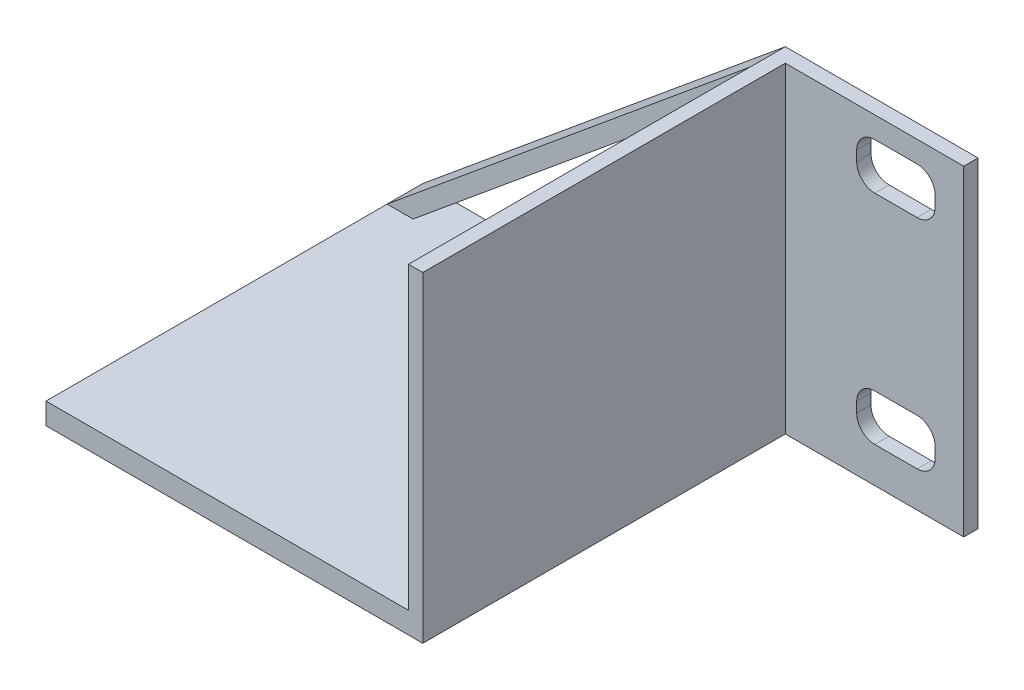
ISO-10303-21;
HEADER;
FILE_DESCRIPTION(('STEP AP214'),'2;1');
FILE_NAME('part.step','',(''),(''),'','','');
FILE_SCHEMA(('AUTOMOTIVE_DESIGN { 1 0 10303 214 1 1 1 1 }'));
ENDSEC;
DATA;
#1=APPLICATION_CONTEXT('core data for automotive mechanical design processes');
#2=APPLICATION_PROTOCOL_DEFINITION('international standard','automotive_design',2000,#1);
#3=PRODUCT_CONTEXT('',#1,'mechanical');
#4=PRODUCT('Part','Part','',(#3));
#5=PRODUCT_RELATED_PRODUCT_CATEGORY('part','',(#4));
#6=PRODUCT_DEFINITION_FORMATION('','',#4);
#7=PRODUCT_DEFINITION_CONTEXT('part definition',#1,'design');
#8=PRODUCT_DEFINITION('design','',#6,#7);
#9=PRODUCT_DEFINITION_SHAPE('','',#8);
#10=(LENGTH_UNIT() NAMED_UNIT(*) SI_UNIT(.MILLI.,.METRE.));
#11=(NAMED_UNIT(*) PLANE_ANGLE_UNIT() SI_UNIT($,.RADIAN.));
#12=(NAMED_UNIT(*) SI_UNIT($,.STERADIAN.) SOLID_ANGLE_UNIT());
#13=UNCERTAINTY_MEASURE_WITH_UNIT(LENGTH_MEASURE(1.E-05),#10,'distance_accuracy_value','');
#14=(GEOMETRIC_REPRESENTATION_CONTEXT(3) GLOBAL_UNCERTAINTY_ASSIGNED_CONTEXT((#13)) GLOBAL_UNIT_ASSIGNED_CONTEXT((#10,
#11,#12)) REPRESENTATION_CONTEXT('',''));
#15=CARTESIAN_POINT('',(0.,0.,0.));
#16=DIRECTION('',(0.,0.,1.));
#17=DIRECTION('',(1.,0.,0.));
#18=AXIS2_PLACEMENT_3D('',#15,#16,#17);
#19=CARTESIAN_POINT('',(0.,0.,2.));
#20=DIRECTION('',(-1.,0.,0.));
#21=DIRECTION('',(0.,-1.,0.));
#22=AXIS2_PLACEMENT_3D('',#19,#20,#21);
#23=PLANE('',#22);
#24=DIRECTION('',(0.,1.,0.));
#25=VECTOR('',#24,1.);
#26=CARTESIAN_POINT('',(0.,0.,0.));
#27=LINE('',#26,#25);
#28=CARTESIAN_POINT('',(0.,0.,0.));
#29=VERTEX_POINT('',#28);
#30=CARTESIAN_POINT('',(0.,45.0000000000001,0.));
#31=VERTEX_POINT('',#30);
#32=EDGE_CURVE('E294',#29,#31,#27,.T.);
#33=ORIENTED_EDGE('',*,*,#32,.T.);
#34=DIRECTION('',(0.,0.,-1.));
#35=VECTOR('',#34,1.);
#36=CARTESIAN_POINT('',(0.,45.0000000000001,2.));
#37=LINE('',#36,#35);
#38=CARTESIAN_POINT('',(0.,45.0000000000001,2.));
#39=VERTEX_POINT('',#38);
#40=EDGE_CURVE('E325',#39,#31,#37,.T.);
#41=ORIENTED_EDGE('',*,*,#40,.F.);
#42=DIRECTION('',(0.,1.,0.));
#43=VECTOR('',#42,1.);
#44=CARTESIAN_POINT('',(0.,0.,2.));
#45=LINE('',#44,#43);
#46=CARTESIAN_POINT('',(0.,0.,2.));
#47=VERTEX_POINT('',#46);
#48=EDGE_CURVE('E305',#47,#39,#45,.T.);
#49=ORIENTED_EDGE('',*,*,#48,.F.);
#50=DIRECTION('',(0.,0.,-1.));
#51=VECTOR('',#50,1.);
#52=CARTESIAN_POINT('',(0.,0.,2.));
#53=LINE('',#52,#51);
#54=EDGE_CURVE('E317',#47,#29,#53,.T.);
#55=ORIENTED_EDGE('',*,*,#54,.T.);
#56=EDGE_LOOP('',(#33,#41,#49,#55));
#57=FACE_BOUND('',#56,.T.);
#58=ADVANCED_FACE('F33',(#57),#23,.F.);
#59=CARTESIAN_POINT('',(0.,45.0000000000001,2.));
#60=DIRECTION('',(0.,-1.,0.));
#61=DIRECTION('',(1.,0.,0.));
#62=AXIS2_PLACEMENT_3D('',#59,#60,#61);
#63=PLANE('',#62);
#64=DIRECTION('',(-1.,0.,0.));
#65=VECTOR('',#64,1.);
#66=CARTESIAN_POINT('',(0.,45.0000000000001,0.));
#67=LINE('',#66,#65);
#68=CARTESIAN_POINT('',(-27.,45.,0.));
#69=VERTEX_POINT('',#68);
#70=EDGE_CURVE('E320',#31,#69,#67,.T.);
#71=ORIENTED_EDGE('',*,*,#70,.T.);
#72=DIRECTION('',(0.,0.,-1.));
#73=VECTOR('',#72,1.);
#74=CARTESIAN_POINT('',(-27.,45.,5.));
#75=LINE('',#74,#73);
#76=CARTESIAN_POINT('',(-27.,45.,5.));
#77=VERTEX_POINT('',#76);
#78=EDGE_CURVE('E56',#77,#69,#75,.T.);
#79=ORIENTED_EDGE('',*,*,#78,.F.);
#80=DIRECTION('',(0.,0.,-1.));
#81=VECTOR('',#80,1.);
#82=CARTESIAN_POINT('',(-27.,45.,2.));
#83=LINE('',#82,#81);
#84=CARTESIAN_POINT('',(-27.,45.,52.8));
#85=VERTEX_POINT('',#84);
#86=EDGE_CURVE('E266',#85,#77,#83,.T.);
#87=ORIENTED_EDGE('',*,*,#86,.F.);
#88=DIRECTION('',(1.,0.,0.));
#89=VECTOR('',#88,1.);
#90=CARTESIAN_POINT('',(-27.,45.,52.8));
#91=LINE('',#90,#89);
#92=CARTESIAN_POINT('',(-25.,45.,52.8));
#93=VERTEX_POINT('',#92);
#94=EDGE_CURVE('E268',#85,#93,#91,.T.);
#95=ORIENTED_EDGE('',*,*,#94,.T.);
#96=DIRECTION('',(0.,0.,-1.));
#97=VECTOR('',#96,1.);
#98=CARTESIAN_POINT('',(-25.,45.,0.));
#99=LINE('',#98,#97);
#100=CARTESIAN_POINT('',(-25.,45.,2.));
#101=VERTEX_POINT('',#100);
#102=EDGE_CURVE('E264',#93,#101,#99,.T.);
#103=ORIENTED_EDGE('',*,*,#102,.T.);
#104=DIRECTION('',(-1.,0.,0.));
#105=VECTOR('',#104,1.);
#106=CARTESIAN_POINT('',(0.,45.0000000000001,2.));
#107=LINE('',#106,#105);
#108=EDGE_CURVE('E308',#39,#101,#107,.T.);
#109=ORIENTED_EDGE('',*,*,#108,.F.);
#110=ORIENTED_EDGE('',*,*,#40,.T.);
#111=EDGE_LOOP('',(#71,#79,#87,#95,#103,#109,#110));
#112=FACE_BOUND('',#111,.T.);
#113=ADVANCED_FACE('F468',(#112),#63,.F.);
#114=CARTESIAN_POINT('',(0.,0.,2.));
#115=DIRECTION('',(0.,1.,0.));
#116=DIRECTION('',(-1.,0.,0.));
#117=AXIS2_PLACEMENT_3D('',#114,#115,#116);
#118=PLANE('',#117);
#119=CARTESIAN_POINT('',(-39.7,-1.23599047663348E-13,17.7));
#120=DIRECTION('',(0.,1.,0.));
#121=DIRECTION('',(-1.,0.,0.));
#122=AXIS2_PLACEMENT_3D('',#119,#120,#121);
#123=CIRCLE('',#122,6.35);
#124=CARTESIAN_POINT('',(-46.05,-1.43351375886795E-13,17.7));
#125=VERTEX_POINT('',#124);
#126=EDGE_CURVE('E784',#125,#125,#123,.T.);
#127=ORIENTED_EDGE('',*,*,#126,.T.);
#128=EDGE_LOOP('',(#127));
#129=FACE_BOUND('',#128,.T.);
#130=DIRECTION('',(1.,0.,0.));
#131=VECTOR('',#130,1.);
#132=CARTESIAN_POINT('',(0.,0.,0.));
#133=LINE('',#132,#131);
#134=CARTESIAN_POINT('',(-77.8,0.,0.));
#135=VERTEX_POINT('',#134);
#136=EDGE_CURVE('E309',#135,#29,#133,.T.);
#137=ORIENTED_EDGE('',*,*,#136,.T.);
#138=ORIENTED_EDGE('',*,*,#54,.F.);
#139=DIRECTION('',(1.,0.,0.));
#140=VECTOR('',#139,1.);
#141=CARTESIAN_POINT('',(0.,0.,2.));
#142=LINE('',#141,#140);
#143=CARTESIAN_POINT('',(-25.,0.,2.));
#144=VERTEX_POINT('',#143);
#145=EDGE_CURVE('E315',#144,#47,#142,.T.);
#146=ORIENTED_EDGE('',*,*,#145,.F.);
#147=DIRECTION('',(0.,0.,1.));
#148=VECTOR('',#147,1.);
#149=CARTESIAN_POINT('',(-25.,0.,2.));
#150=LINE('',#149,#148);
#151=CARTESIAN_POINT('',(-25.,0.,52.8));
#152=VERTEX_POINT('',#151);
#153=EDGE_CURVE('E260',#144,#152,#150,.T.);
#154=ORIENTED_EDGE('',*,*,#153,.T.);
#155=DIRECTION('',(1.,0.,0.));
#156=VECTOR('',#155,1.);
#157=CARTESIAN_POINT('',(-27.,0.,52.8));
#158=LINE('',#157,#156);
#159=CARTESIAN_POINT('',(-77.8,0.,52.8));
#160=VERTEX_POINT('',#159);
#161=EDGE_CURVE('E277',#160,#152,#158,.T.);
#162=ORIENTED_EDGE('',*,*,#161,.F.);
#163=DIRECTION('',(0.,0.,1.));
#164=VECTOR('',#163,1.);
#165=CARTESIAN_POINT('',(-77.8,0.,0.));
#166=LINE('',#165,#164);
#167=EDGE_CURVE('E251',#135,#160,#166,.T.);
#168=ORIENTED_EDGE('',*,*,#167,.F.);
#169=EDGE_LOOP('',(#137,#138,#146,#154,#162,#168));
#170=FACE_BOUND('',#169,.T.);
#171=ADVANCED_FACE('F474',(#129,#170),#118,.F.);
#172=CARTESIAN_POINT('',(0.,0.,2.));
#173=DIRECTION('',(0.,0.,1.));
#174=DIRECTION('',(1.,0.,0.));
#175=AXIS2_PLACEMENT_3D('',#172,#173,#174);
#176=PLANE('',#175);
#177=DIRECTION('',(-1.,0.,0.));
#178=VECTOR('',#177,1.);
#179=CARTESIAN_POINT('',(-4.,11.5,2.));
#180=LINE('',#179,#178);
#181=CARTESIAN_POINT('',(-6.54,11.5,2.));
#182=VERTEX_POINT('',#181);
#183=CARTESIAN_POINT('',(-12.46,11.5,2.));
#184=VERTEX_POINT('',#183);
#185=EDGE_CURVE('E281',#182,#184,#180,.T.);
#186=ORIENTED_EDGE('',*,*,#185,.F.);
#187=CARTESIAN_POINT('',(-6.54,8.96000000000004,2.));
#188=DIRECTION('',(0.,0.,1.));
#189=DIRECTION('',(1.,0.,0.));
#190=AXIS2_PLACEMENT_3D('',#187,#188,#189);
#191=CIRCLE('',#190,2.54);
#192=CARTESIAN_POINT('',(-4.,8.96000000000004,2.));
#193=VERTEX_POINT('',#192);
#194=EDGE_CURVE('E404',#182,#193,#191,.F.);
#195=ORIENTED_EDGE('',*,*,#194,.T.);
#196=DIRECTION('',(0.,1.,0.));
#197=VECTOR('',#196,1.);
#198=CARTESIAN_POINT('',(-4.,5.00000000000004,2.));
#199=LINE('',#198,#197);
#200=CARTESIAN_POINT('',(-4.,7.54000000000004,2.));
#201=VERTEX_POINT('',#200);
#202=EDGE_CURVE('E291',#201,#193,#199,.T.);
#203=ORIENTED_EDGE('',*,*,#202,.F.);
#204=CARTESIAN_POINT('',(-6.54,7.54000000000004,2.));
#205=DIRECTION('',(0.,0.,1.));
#206=DIRECTION('',(1.,0.,0.));
#207=AXIS2_PLACEMENT_3D('',#204,#205,#206);
#208=CIRCLE('',#207,2.54);
#209=CARTESIAN_POINT('',(-6.54000000000001,5.00000000000004,2.));
#210=VERTEX_POINT('',#209);
#211=EDGE_CURVE('E400',#201,#210,#208,.F.);
#212=ORIENTED_EDGE('',*,*,#211,.T.);
#213=DIRECTION('',(1.,0.,0.));
#214=VECTOR('',#213,1.);
#215=CARTESIAN_POINT('',(-15.,5.00000000000004,2.));
#216=LINE('',#215,#214);
#217=CARTESIAN_POINT('',(-12.46,5.00000000000004,2.));
#218=VERTEX_POINT('',#217);
#219=EDGE_CURVE('E288',#218,#210,#216,.T.);
#220=ORIENTED_EDGE('',*,*,#219,.F.);
#221=CARTESIAN_POINT('',(-12.46,7.54000000000004,2.));
#222=DIRECTION('',(0.,0.,1.));
#223=DIRECTION('',(1.,0.,0.));
#224=AXIS2_PLACEMENT_3D('',#221,#222,#223);
#225=CIRCLE('',#224,2.54);
#226=CARTESIAN_POINT('',(-15.,7.54000000000004,2.));
#227=VERTEX_POINT('',#226);
#228=EDGE_CURVE('E392',#218,#227,#225,.F.);
#229=ORIENTED_EDGE('',*,*,#228,.T.);
#230=DIRECTION('',(0.,-1.,0.));
#231=VECTOR('',#230,1.);
#232=CARTESIAN_POINT('',(-15.,11.5,2.));
#233=LINE('',#232,#231);
#234=CARTESIAN_POINT('',(-15.,8.96000000000004,2.));
#235=VERTEX_POINT('',#234);
#236=EDGE_CURVE('E284',#235,#227,#233,.T.);
#237=ORIENTED_EDGE('',*,*,#236,.F.);
#238=CARTESIAN_POINT('',(-12.46,8.96000000000004,2.));
#239=DIRECTION('',(0.,0.,1.));
#240=DIRECTION('',(1.,0.,0.));
#241=AXIS2_PLACEMENT_3D('',#238,#239,#240);
#242=CIRCLE('',#241,2.54);
#243=EDGE_CURVE('E396',#235,#184,#242,.F.);
#244=ORIENTED_EDGE('',*,*,#243,.T.);
#245=EDGE_LOOP('',(#186,#195,#203,#212,#220,#229,#237,#244));
#246=FACE_BOUND('',#245,.T.);
#247=DIRECTION('',(-1.,0.,0.));
#248=VECTOR('',#247,1.);
#249=CARTESIAN_POINT('',(-4.00000000000002,42.0000000000001,2.));
#250=LINE('',#249,#248);
#251=CARTESIAN_POINT('',(-6.54000000000004,42.0000000000001,2.));
#252=VERTEX_POINT('',#251);
#253=CARTESIAN_POINT('',(-12.46,42.,2.));
#254=VERTEX_POINT('',#253);
#255=EDGE_CURVE('E280',#252,#254,#250,.T.);
#256=ORIENTED_EDGE('',*,*,#255,.F.);
#257=CARTESIAN_POINT('',(-6.54000000000002,39.4600000000001,2.));
#258=DIRECTION('',(0.,0.,1.));
#259=DIRECTION('',(1.,0.,0.));
#260=AXIS2_PLACEMENT_3D('',#257,#258,#259);
#261=CIRCLE('',#260,2.54);
#262=CARTESIAN_POINT('',(-4.00000000000002,39.4600000000001,2.));
#263=VERTEX_POINT('',#262);
#264=EDGE_CURVE('E412',#252,#263,#261,.F.);
#265=ORIENTED_EDGE('',*,*,#264,.T.);
#266=DIRECTION('',(0.,1.,0.));
#267=VECTOR('',#266,1.);
#268=CARTESIAN_POINT('',(-4.00000000000002,35.5,2.));
#269=LINE('',#268,#267);
#270=CARTESIAN_POINT('',(-4.00000000000002,38.04,2.));
#271=VERTEX_POINT('',#270);
#272=EDGE_CURVE('E285',#271,#263,#269,.T.);
#273=ORIENTED_EDGE('',*,*,#272,.F.);
#274=CARTESIAN_POINT('',(-6.54000000000002,38.04,2.));
#275=DIRECTION('',(0.,0.,1.));
#276=DIRECTION('',(1.,0.,0.));
#277=AXIS2_PLACEMENT_3D('',#274,#275,#276);
#278=CIRCLE('',#277,2.54);
#279=CARTESIAN_POINT('',(-6.54000000000002,35.5,2.));
#280=VERTEX_POINT('',#279);
#281=EDGE_CURVE('E408',#271,#280,#278,.F.);
#282=ORIENTED_EDGE('',*,*,#281,.T.);
#283=DIRECTION('',(1.,0.,0.));
#284=VECTOR('',#283,1.);
#285=CARTESIAN_POINT('',(-15.,35.5,2.));
#286=LINE('',#285,#284);
#287=CARTESIAN_POINT('',(-12.46,35.5,2.));
#288=VERTEX_POINT('',#287);
#289=EDGE_CURVE('E300',#288,#280,#286,.T.);
#290=ORIENTED_EDGE('',*,*,#289,.F.);
#291=CARTESIAN_POINT('',(-12.46,38.04,2.));
#292=DIRECTION('',(0.,0.,1.));
#293=DIRECTION('',(1.,0.,0.));
#294=AXIS2_PLACEMENT_3D('',#291,#292,#293);
#295=CIRCLE('',#294,2.54);
#296=CARTESIAN_POINT('',(-15.,38.04,2.));
#297=VERTEX_POINT('',#296);
#298=EDGE_CURVE('E41',#288,#297,#295,.F.);
#299=ORIENTED_EDGE('',*,*,#298,.T.);
#300=DIRECTION('',(0.,-1.,0.));
#301=VECTOR('',#300,1.);
#302=CARTESIAN_POINT('',(-15.,42.,2.));
#303=LINE('',#302,#301);
#304=CARTESIAN_POINT('',(-15.,39.4600000000001,2.));
#305=VERTEX_POINT('',#304);
#306=EDGE_CURVE('E297',#305,#297,#303,.T.);
#307=ORIENTED_EDGE('',*,*,#306,.F.);
#308=CARTESIAN_POINT('',(-12.46,39.4600000000001,2.));
#309=DIRECTION('',(0.,0.,1.));
#310=DIRECTION('',(1.,0.,0.));
#311=AXIS2_PLACEMENT_3D('',#308,#309,#310);
#312=CIRCLE('',#311,2.54);
#313=EDGE_CURVE('E416',#305,#254,#312,.F.);
#314=ORIENTED_EDGE('',*,*,#313,.T.);
#315=EDGE_LOOP('',(#256,#265,#273,#282,#290,#299,#307,#314));
#316=FACE_BOUND('',#315,.T.);
#317=ORIENTED_EDGE('',*,*,#48,.T.);
#318=ORIENTED_EDGE('',*,*,#108,.T.);
#319=DIRECTION('',(0.,-1.,0.));
#320=VECTOR('',#319,1.);
#321=CARTESIAN_POINT('',(-25.,0.,2.));
#322=LINE('',#321,#320);
#323=EDGE_CURVE('E312',#101,#144,#322,.T.);
#324=ORIENTED_EDGE('',*,*,#323,.T.);
#325=ORIENTED_EDGE('',*,*,#145,.T.);
#326=EDGE_LOOP('',(#317,#318,#324,#325));
#327=FACE_BOUND('',#326,.T.);
#328=ADVANCED_FACE('F423',(#246,#316,#327),#176,.T.);
#329=CARTESIAN_POINT('',(0.,0.,0.));
#330=DIRECTION('',(0.,0.,1.));
#331=DIRECTION('',(1.,0.,0.));
#332=AXIS2_PLACEMENT_3D('',#329,#330,#331);
#333=PLANE('',#332);
#334=DIRECTION('',(-0.770702582293763,-0.637195048353113,0.));
#335=VECTOR('',#334,1.);
#336=CARTESIAN_POINT('',(-77.8,0.,0.));
#337=LINE('',#336,#335);
#338=CARTESIAN_POINT('',(-27.,42.,0.));
#339=VERTEX_POINT('',#338);
#340=CARTESIAN_POINT('',(-74.1714285714286,2.99999999999992,0.));
#341=VERTEX_POINT('',#340);
#342=EDGE_CURVE('E785',#339,#341,#337,.T.);
#343=ORIENTED_EDGE('',*,*,#342,.T.);
#344=DIRECTION('',(1.,0.,0.));
#345=VECTOR('',#344,1.);
#346=CARTESIAN_POINT('',(-77.8,2.99999999999992,0.));
#347=LINE('',#346,#345);
#348=CARTESIAN_POINT('',(-27.,2.99999999999992,0.));
#349=VERTEX_POINT('',#348);
#350=EDGE_CURVE('E246',#341,#349,#347,.T.);
#351=ORIENTED_EDGE('',*,*,#350,.T.);
#352=DIRECTION('',(0.,-1.,0.));
#353=VECTOR('',#352,1.);
#354=CARTESIAN_POINT('',(-27.,45.,0.));
#355=LINE('',#354,#353);
#356=EDGE_CURVE('E261',#339,#349,#355,.T.);
#357=ORIENTED_EDGE('',*,*,#356,.F.);
#358=EDGE_LOOP('',(#343,#351,#357));
#359=FACE_BOUND('',#358,.T.);
#360=DIRECTION('',(1.,0.,0.));
#361=VECTOR('',#360,1.);
#362=CARTESIAN_POINT('',(0.,5.00000000000004,0.));
#363=LINE('',#362,#361);
#364=CARTESIAN_POINT('',(-12.46,5.00000000000004,0.));
#365=VERTEX_POINT('',#364);
#366=CARTESIAN_POINT('',(-6.54,5.00000000000004,0.));
#367=VERTEX_POINT('',#366);
#368=EDGE_CURVE('E343',#365,#367,#363,.T.);
#369=ORIENTED_EDGE('',*,*,#368,.T.);
#370=CARTESIAN_POINT('',(-6.54,7.54000000000004,0.));
#371=DIRECTION('',(0.,0.,1.));
#372=DIRECTION('',(1.,0.,0.));
#373=AXIS2_PLACEMENT_3D('',#370,#371,#372);
#374=CIRCLE('',#373,2.54);
#375=CARTESIAN_POINT('',(-4.,7.54000000000004,0.));
#376=VERTEX_POINT('',#375);
#377=EDGE_CURVE('E402',#367,#376,#374,.T.);
#378=ORIENTED_EDGE('',*,*,#377,.T.);
#379=DIRECTION('',(0.,1.,0.));
#380=VECTOR('',#379,1.);
#381=CARTESIAN_POINT('',(-4.,0.,0.));
#382=LINE('',#381,#380);
#383=CARTESIAN_POINT('',(-4.,8.96000000000004,0.));
#384=VERTEX_POINT('',#383);
#385=EDGE_CURVE('E346',#376,#384,#382,.T.);
#386=ORIENTED_EDGE('',*,*,#385,.T.);
#387=CARTESIAN_POINT('',(-6.54,8.96000000000004,0.));
#388=DIRECTION('',(0.,0.,1.));
#389=DIRECTION('',(1.,0.,0.));
#390=AXIS2_PLACEMENT_3D('',#387,#388,#389);
#391=CIRCLE('',#390,2.54);
#392=CARTESIAN_POINT('',(-6.54,11.5,0.));
#393=VERTEX_POINT('',#392);
#394=EDGE_CURVE('E406',#384,#393,#391,.T.);
#395=ORIENTED_EDGE('',*,*,#394,.T.);
#396=DIRECTION('',(-1.,0.,0.));
#397=VECTOR('',#396,1.);
#398=CARTESIAN_POINT('',(0.,11.5,0.));
#399=LINE('',#398,#397);
#400=CARTESIAN_POINT('',(-12.46,11.5,0.));
#401=VERTEX_POINT('',#400);
#402=EDGE_CURVE('E349',#393,#401,#399,.T.);
#403=ORIENTED_EDGE('',*,*,#402,.T.);
#404=CARTESIAN_POINT('',(-12.46,8.96000000000004,0.));
#405=DIRECTION('',(0.,0.,1.));
#406=DIRECTION('',(1.,0.,0.));
#407=AXIS2_PLACEMENT_3D('',#404,#405,#406);
#408=CIRCLE('',#407,2.54);
#409=CARTESIAN_POINT('',(-15.,8.96000000000004,0.));
#410=VERTEX_POINT('',#409);
#411=EDGE_CURVE('E398',#401,#410,#408,.T.);
#412=ORIENTED_EDGE('',*,*,#411,.T.);
#413=DIRECTION('',(0.,-1.,0.));
#414=VECTOR('',#413,1.);
#415=CARTESIAN_POINT('',(-15.,0.,0.));
#416=LINE('',#415,#414);
#417=CARTESIAN_POINT('',(-15.,7.54000000000004,0.));
#418=VERTEX_POINT('',#417);
#419=EDGE_CURVE('E340',#410,#418,#416,.T.);
#420=ORIENTED_EDGE('',*,*,#419,.T.);
#421=CARTESIAN_POINT('',(-12.46,7.54000000000004,0.));
#422=DIRECTION('',(0.,0.,1.));
#423=DIRECTION('',(1.,0.,0.));
#424=AXIS2_PLACEMENT_3D('',#421,#422,#423);
#425=CIRCLE('',#424,2.54);
#426=EDGE_CURVE('E394',#418,#365,#425,.T.);
#427=ORIENTED_EDGE('',*,*,#426,.T.);
#428=EDGE_LOOP('',(#369,#378,#386,#395,#403,#412,#420,#427));
#429=FACE_BOUND('',#428,.T.);
#430=DIRECTION('',(1.,0.,0.));
#431=VECTOR('',#430,1.);
#432=CARTESIAN_POINT('',(0.,35.5,0.));
#433=LINE('',#432,#431);
#434=CARTESIAN_POINT('',(-12.46,35.5,0.));
#435=VERTEX_POINT('',#434);
#436=CARTESIAN_POINT('',(-6.54000000000002,35.5,0.));
#437=VERTEX_POINT('',#436);
#438=EDGE_CURVE('E331',#435,#437,#433,.T.);
#439=ORIENTED_EDGE('',*,*,#438,.T.);
#440=CARTESIAN_POINT('',(-6.54000000000002,38.04,0.));
#441=DIRECTION('',(0.,0.,1.));
#442=DIRECTION('',(1.,0.,0.));
#443=AXIS2_PLACEMENT_3D('',#440,#441,#442);
#444=CIRCLE('',#443,2.54);
#445=CARTESIAN_POINT('',(-4.00000000000002,38.04,0.));
#446=VERTEX_POINT('',#445);
#447=EDGE_CURVE('E410',#437,#446,#444,.T.);
#448=ORIENTED_EDGE('',*,*,#447,.T.);
#449=DIRECTION('',(0.,1.,0.));
#450=VECTOR('',#449,1.);
#451=CARTESIAN_POINT('',(-4.00000000000002,0.,0.));
#452=LINE('',#451,#450);
#453=CARTESIAN_POINT('',(-4.00000000000002,39.4600000000001,0.));
#454=VERTEX_POINT('',#453);
#455=EDGE_CURVE('E334',#446,#454,#452,.T.);
#456=ORIENTED_EDGE('',*,*,#455,.T.);
#457=CARTESIAN_POINT('',(-6.54000000000002,39.4600000000001,0.));
#458=DIRECTION('',(0.,0.,1.));
#459=DIRECTION('',(1.,0.,0.));
#460=AXIS2_PLACEMENT_3D('',#457,#458,#459);
#461=CIRCLE('',#460,2.54);
#462=CARTESIAN_POINT('',(-6.54000000000004,42.0000000000001,0.));
#463=VERTEX_POINT('',#462);
#464=EDGE_CURVE('E414',#454,#463,#461,.T.);
#465=ORIENTED_EDGE('',*,*,#464,.T.);
#466=DIRECTION('',(-1.,0.,0.));
#467=VECTOR('',#466,1.);
#468=CARTESIAN_POINT('',(-2.1195166833753E-13,42.0000000000001,0.));
#469=LINE('',#468,#467);
#470=CARTESIAN_POINT('',(-12.46,42.,0.));
#471=VERTEX_POINT('',#470);
#472=EDGE_CURVE('E337',#463,#471,#469,.T.);
#473=ORIENTED_EDGE('',*,*,#472,.T.);
#474=CARTESIAN_POINT('',(-12.46,39.4600000000001,0.));
#475=DIRECTION('',(0.,0.,1.));
#476=DIRECTION('',(1.,0.,0.));
#477=AXIS2_PLACEMENT_3D('',#474,#475,#476);
#478=CIRCLE('',#477,2.54);
#479=CARTESIAN_POINT('',(-15.,39.4600000000001,0.));
#480=VERTEX_POINT('',#479);
#481=EDGE_CURVE('E418',#471,#480,#478,.T.);
#482=ORIENTED_EDGE('',*,*,#481,.T.);
#483=DIRECTION('',(0.,-1.,0.));
#484=VECTOR('',#483,1.);
#485=CARTESIAN_POINT('',(-15.,0.,0.));
#486=LINE('',#485,#484);
#487=CARTESIAN_POINT('',(-15.,38.04,0.));
#488=VERTEX_POINT('',#487);
#489=EDGE_CURVE('E328',#480,#488,#486,.T.);
#490=ORIENTED_EDGE('',*,*,#489,.T.);
#491=CARTESIAN_POINT('',(-12.46,38.04,0.));
#492=DIRECTION('',(0.,0.,1.));
#493=DIRECTION('',(1.,0.,0.));
#494=AXIS2_PLACEMENT_3D('',#491,#492,#493);
#495=CIRCLE('',#494,2.54);
#496=EDGE_CURVE('E11',#488,#435,#495,.T.);
#497=ORIENTED_EDGE('',*,*,#496,.T.);
#498=EDGE_LOOP('',(#439,#448,#456,#465,#473,#482,#490,#497));
#499=FACE_BOUND('',#498,.T.);
#500=ORIENTED_EDGE('',*,*,#136,.F.);
#501=DIRECTION('',(0.,-1.,0.));
#502=VECTOR('',#501,1.);
#503=CARTESIAN_POINT('',(-77.8,0.,0.));
#504=LINE('',#503,#502);
#505=CARTESIAN_POINT('',(-77.8,2.99999999999992,0.));
#506=VERTEX_POINT('',#505);
#507=EDGE_CURVE('E257',#506,#135,#504,.T.);
#508=ORIENTED_EDGE('',*,*,#507,.F.);
#509=DIRECTION('',(0.770702582293763,0.637195048353113,0.));
#510=VECTOR('',#509,1.);
#511=CARTESIAN_POINT('',(-27.,45.,0.));
#512=LINE('',#511,#510);
#513=EDGE_CURVE('E218',#506,#69,#512,.T.);
#514=ORIENTED_EDGE('',*,*,#513,.T.);
#515=ORIENTED_EDGE('',*,*,#70,.F.);
#516=ORIENTED_EDGE('',*,*,#32,.F.);
#517=EDGE_LOOP('',(#500,#508,#514,#515,#516));
#518=FACE_BOUND('',#517,.T.);
#519=ADVANCED_FACE('F435',(#359,#429,#499,#518),#333,.F.);
#520=CARTESIAN_POINT('',(-4.00000000000002,42.0000000000001,-17.78));
#521=DIRECTION('',(0.,1.,0.));
#522=DIRECTION('',(-1.,0.,0.));
#523=AXIS2_PLACEMENT_3D('',#520,#521,#522);
#524=PLANE('',#523);
#525=ORIENTED_EDGE('',*,*,#472,.F.);
#526=DIRECTION('',(0.,0.,1.));
#527=VECTOR('',#526,1.);
#528=CARTESIAN_POINT('',(-6.54000000000004,42.0000000000001,2.));
#529=LINE('',#528,#527);
#530=EDGE_CURVE('E384',#463,#252,#529,.T.);
#531=ORIENTED_EDGE('',*,*,#530,.T.);
#532=ORIENTED_EDGE('',*,*,#255,.T.);
#533=DIRECTION('',(0.,0.,1.));
#534=VECTOR('',#533,1.);
#535=CARTESIAN_POINT('',(-12.46,42.,0.));
#536=LINE('',#535,#534);
#537=EDGE_CURVE('E382',#254,#471,#536,.F.);
#538=ORIENTED_EDGE('',*,*,#537,.T.);
#539=EDGE_LOOP('',(#525,#531,#532,#538));
#540=FACE_BOUND('',#539,.T.);
#541=ADVANCED_FACE('F456',(#540),#524,.F.);
#542=CARTESIAN_POINT('',(-4.00000000000002,35.5,-17.78));
#543=DIRECTION('',(1.,0.,0.));
#544=DIRECTION('',(0.,0.,-1.));
#545=AXIS2_PLACEMENT_3D('',#542,#543,#544);
#546=PLANE('',#545);
#547=ORIENTED_EDGE('',*,*,#455,.F.);
#548=DIRECTION('',(0.,0.,1.));
#549=VECTOR('',#548,1.);
#550=CARTESIAN_POINT('',(-4.00000000000002,38.04,2.));
#551=LINE('',#550,#549);
#552=EDGE_CURVE('E374',#446,#271,#551,.T.);
#553=ORIENTED_EDGE('',*,*,#552,.T.);
#554=ORIENTED_EDGE('',*,*,#272,.T.);
#555=DIRECTION('',(0.,0.,1.));
#556=VECTOR('',#555,1.);
#557=CARTESIAN_POINT('',(-4.00000000000002,39.4600000000001,0.));
#558=LINE('',#557,#556);
#559=EDGE_CURVE('E372',#263,#454,#558,.F.);
#560=ORIENTED_EDGE('',*,*,#559,.T.);
#561=EDGE_LOOP('',(#547,#553,#554,#560));
#562=FACE_BOUND('',#561,.T.);
#563=ADVANCED_FACE('F447',(#562),#546,.F.);
#564=CARTESIAN_POINT('',(-15.,35.5,-17.78));
#565=DIRECTION('',(0.,-1.,0.));
#566=DIRECTION('',(0.,0.,-1.));
#567=AXIS2_PLACEMENT_3D('',#564,#565,#566);
#568=PLANE('',#567);
#569=ORIENTED_EDGE('',*,*,#289,.T.);
#570=DIRECTION('',(0.,0.,1.));
#571=VECTOR('',#570,1.);
#572=CARTESIAN_POINT('',(-6.54000000000002,35.5,0.));
#573=LINE('',#572,#571);
#574=EDGE_CURVE('E380',#280,#437,#573,.F.);
#575=ORIENTED_EDGE('',*,*,#574,.T.);
#576=ORIENTED_EDGE('',*,*,#438,.F.);
#577=DIRECTION('',(0.,0.,1.));
#578=VECTOR('',#577,1.);
#579=CARTESIAN_POINT('',(-12.46,35.5,2.));
#580=LINE('',#579,#578);
#581=EDGE_CURVE('E377',#435,#288,#580,.T.);
#582=ORIENTED_EDGE('',*,*,#581,.T.);
#583=EDGE_LOOP('',(#569,#575,#576,#582));
#584=FACE_BOUND('',#583,.T.);
#585=ADVANCED_FACE('F439',(#584),#568,.F.);
#586=CARTESIAN_POINT('',(-15.,42.,-17.78));
#587=DIRECTION('',(-1.,0.,0.));
#588=DIRECTION('',(0.,0.,1.));
#589=AXIS2_PLACEMENT_3D('',#586,#587,#588);
#590=PLANE('',#589);
#591=ORIENTED_EDGE('',*,*,#489,.F.);
#592=DIRECTION('',(0.,0.,1.));
#593=VECTOR('',#592,1.);
#594=CARTESIAN_POINT('',(-15.,39.4600000000001,2.));
#595=LINE('',#594,#593);
#596=EDGE_CURVE('E389',#480,#305,#595,.T.);
#597=ORIENTED_EDGE('',*,*,#596,.T.);
#598=ORIENTED_EDGE('',*,*,#306,.T.);
#599=DIRECTION('',(0.,0.,1.));
#600=VECTOR('',#599,1.);
#601=CARTESIAN_POINT('',(-15.,38.04,0.));
#602=LINE('',#601,#600);
#603=EDGE_CURVE('E387',#297,#488,#602,.F.);
#604=ORIENTED_EDGE('',*,*,#603,.T.);
#605=EDGE_LOOP('',(#591,#597,#598,#604));
#606=FACE_BOUND('',#605,.T.);
#607=ADVANCED_FACE('F430',(#606),#590,.F.);
#608=CARTESIAN_POINT('',(-4.,11.5,-17.78));
#609=DIRECTION('',(0.,1.,0.));
#610=DIRECTION('',(0.,0.,1.));
#611=AXIS2_PLACEMENT_3D('',#608,#609,#610);
#612=PLANE('',#611);
#613=ORIENTED_EDGE('',*,*,#185,.T.);
#614=DIRECTION('',(0.,0.,1.));
#615=VECTOR('',#614,1.);
#616=CARTESIAN_POINT('',(-12.46,11.5,0.));
#617=LINE('',#616,#615);
#618=EDGE_CURVE('E365',#184,#401,#617,.F.);
#619=ORIENTED_EDGE('',*,*,#618,.T.);
#620=ORIENTED_EDGE('',*,*,#402,.F.);
#621=DIRECTION('',(0.,0.,1.));
#622=VECTOR('',#621,1.);
#623=CARTESIAN_POINT('',(-6.54,11.5,2.));
#624=LINE('',#623,#622);
#625=EDGE_CURVE('E362',#393,#182,#624,.T.);
#626=ORIENTED_EDGE('',*,*,#625,.T.);
#627=EDGE_LOOP('',(#613,#619,#620,#626));
#628=FACE_BOUND('',#627,.T.);
#629=ADVANCED_FACE('F646',(#628),#612,.F.);
#630=CARTESIAN_POINT('',(-4.,5.00000000000004,-17.78));
#631=DIRECTION('',(1.,0.,0.));
#632=DIRECTION('',(0.,0.,-1.));
#633=AXIS2_PLACEMENT_3D('',#630,#631,#632);
#634=PLANE('',#633);
#635=ORIENTED_EDGE('',*,*,#385,.F.);
#636=DIRECTION('',(0.,0.,1.));
#637=VECTOR('',#636,1.);
#638=CARTESIAN_POINT('',(-4.,7.54000000000004,2.));
#639=LINE('',#638,#637);
#640=EDGE_CURVE('E369',#376,#201,#639,.T.);
#641=ORIENTED_EDGE('',*,*,#640,.T.);
#642=ORIENTED_EDGE('',*,*,#202,.T.);
#643=DIRECTION('',(0.,0.,1.));
#644=VECTOR('',#643,1.);
#645=CARTESIAN_POINT('',(-4.,8.96000000000004,0.));
#646=LINE('',#645,#644);
#647=EDGE_CURVE('E367',#193,#384,#646,.F.);
#648=ORIENTED_EDGE('',*,*,#647,.T.);
#649=EDGE_LOOP('',(#635,#641,#642,#648));
#650=FACE_BOUND('',#649,.T.);
#651=ADVANCED_FACE('F642',(#650),#634,.F.);
#652=CARTESIAN_POINT('',(-15.,5.00000000000004,-17.78));
#653=DIRECTION('',(0.,-1.,0.));
#654=DIRECTION('',(0.,0.,-1.));
#655=AXIS2_PLACEMENT_3D('',#652,#653,#654);
#656=PLANE('',#655);
#657=ORIENTED_EDGE('',*,*,#368,.F.);
#658=DIRECTION('',(0.,0.,1.));
#659=VECTOR('',#658,1.);
#660=CARTESIAN_POINT('',(-12.46,5.00000000000004,2.));
#661=LINE('',#660,#659);
#662=EDGE_CURVE('E354',#365,#218,#661,.T.);
#663=ORIENTED_EDGE('',*,*,#662,.T.);
#664=ORIENTED_EDGE('',*,*,#219,.T.);
#665=DIRECTION('',(0.,0.,1.));
#666=VECTOR('',#665,1.);
#667=CARTESIAN_POINT('',(-6.54,5.00000000000004,0.));
#668=LINE('',#667,#666);
#669=EDGE_CURVE('E352',#210,#367,#668,.F.);
#670=ORIENTED_EDGE('',*,*,#669,.T.);
#671=EDGE_LOOP('',(#657,#663,#664,#670));
#672=FACE_BOUND('',#671,.T.);
#673=ADVANCED_FACE('F645',(#672),#656,.F.);
#674=CARTESIAN_POINT('',(-15.,11.5,-17.78));
#675=DIRECTION('',(-1.,0.,0.));
#676=DIRECTION('',(0.,0.,1.));
#677=AXIS2_PLACEMENT_3D('',#674,#675,#676);
#678=PLANE('',#677);
#679=ORIENTED_EDGE('',*,*,#236,.T.);
#680=DIRECTION('',(0.,0.,1.));
#681=VECTOR('',#680,1.);
#682=CARTESIAN_POINT('',(-15.,7.54000000000004,0.));
#683=LINE('',#682,#681);
#684=EDGE_CURVE('E360',#227,#418,#683,.F.);
#685=ORIENTED_EDGE('',*,*,#684,.T.);
#686=ORIENTED_EDGE('',*,*,#419,.F.);
#687=DIRECTION('',(0.,0.,1.));
#688=VECTOR('',#687,1.);
#689=CARTESIAN_POINT('',(-15.,8.96000000000004,2.));
#690=LINE('',#689,#688);
#691=EDGE_CURVE('E357',#410,#235,#690,.T.);
#692=ORIENTED_EDGE('',*,*,#691,.T.);
#693=EDGE_LOOP('',(#679,#685,#686,#692));
#694=FACE_BOUND('',#693,.T.);
#695=ADVANCED_FACE('F482',(#694),#678,.F.);
#696=CARTESIAN_POINT('',(-12.46,7.54000000000004,-17.78));
#697=DIRECTION('',(0.,0.,-1.));
#698=DIRECTION('',(-1.,0.,0.));
#699=AXIS2_PLACEMENT_3D('',#696,#697,#698);
#700=CYLINDRICAL_SURFACE('',#699,2.54);
#701=ORIENTED_EDGE('',*,*,#426,.F.);
#702=ORIENTED_EDGE('',*,*,#684,.F.);
#703=ORIENTED_EDGE('',*,*,#228,.F.);
#704=ORIENTED_EDGE('',*,*,#662,.F.);
#705=EDGE_LOOP('',(#701,#702,#703,#704));
#706=FACE_BOUND('',#705,.T.);
#707=ADVANCED_FACE('F478',(#706),#700,.F.);
#708=CARTESIAN_POINT('',(-12.46,8.96000000000004,-17.78));
#709=DIRECTION('',(0.,0.,-1.));
#710=DIRECTION('',(-1.,0.,0.));
#711=AXIS2_PLACEMENT_3D('',#708,#709,#710);
#712=CYLINDRICAL_SURFACE('',#711,2.54);
#713=ORIENTED_EDGE('',*,*,#411,.F.);
#714=ORIENTED_EDGE('',*,*,#618,.F.);
#715=ORIENTED_EDGE('',*,*,#243,.F.);
#716=ORIENTED_EDGE('',*,*,#691,.F.);
#717=EDGE_LOOP('',(#713,#714,#715,#716));
#718=FACE_BOUND('',#717,.T.);
#719=ADVANCED_FACE('F481',(#718),#712,.F.);
#720=CARTESIAN_POINT('',(-6.54,7.54000000000004,-17.78));
#721=DIRECTION('',(0.,0.,-1.));
#722=DIRECTION('',(-1.,0.,0.));
#723=AXIS2_PLACEMENT_3D('',#720,#721,#722);
#724=CYLINDRICAL_SURFACE('',#723,2.54);
#725=ORIENTED_EDGE('',*,*,#377,.F.);
#726=ORIENTED_EDGE('',*,*,#669,.F.);
#727=ORIENTED_EDGE('',*,*,#211,.F.);
#728=ORIENTED_EDGE('',*,*,#640,.F.);
#729=EDGE_LOOP('',(#725,#726,#727,#728));
#730=FACE_BOUND('',#729,.T.);
#731=ADVANCED_FACE('F486',(#730),#724,.F.);
#732=CARTESIAN_POINT('',(-6.54,8.96000000000004,-17.78));
#733=DIRECTION('',(0.,0.,-1.));
#734=DIRECTION('',(-1.,0.,0.));
#735=AXIS2_PLACEMENT_3D('',#732,#733,#734);
#736=CYLINDRICAL_SURFACE('',#735,2.54);
#737=ORIENTED_EDGE('',*,*,#394,.F.);
#738=ORIENTED_EDGE('',*,*,#647,.F.);
#739=ORIENTED_EDGE('',*,*,#194,.F.);
#740=ORIENTED_EDGE('',*,*,#625,.F.);
#741=EDGE_LOOP('',(#737,#738,#739,#740));
#742=FACE_BOUND('',#741,.T.);
#743=ADVANCED_FACE('F490',(#742),#736,.F.);
#744=CARTESIAN_POINT('',(-6.54000000000002,38.04,-17.78));
#745=DIRECTION('',(0.,0.,-1.));
#746=DIRECTION('',(-1.,0.,0.));
#747=AXIS2_PLACEMENT_3D('',#744,#745,#746);
#748=CYLINDRICAL_SURFACE('',#747,2.54);
#749=ORIENTED_EDGE('',*,*,#447,.F.);
#750=ORIENTED_EDGE('',*,*,#574,.F.);
#751=ORIENTED_EDGE('',*,*,#281,.F.);
#752=ORIENTED_EDGE('',*,*,#552,.F.);
#753=EDGE_LOOP('',(#749,#750,#751,#752));
#754=FACE_BOUND('',#753,.T.);
#755=ADVANCED_FACE('F442',(#754),#748,.F.);
#756=CARTESIAN_POINT('',(-6.54000000000002,39.4600000000001,-17.78));
#757=DIRECTION('',(0.,0.,-1.));
#758=DIRECTION('',(-1.,0.,0.));
#759=AXIS2_PLACEMENT_3D('',#756,#757,#758);
#760=CYLINDRICAL_SURFACE('',#759,2.54);
#761=ORIENTED_EDGE('',*,*,#464,.F.);
#762=ORIENTED_EDGE('',*,*,#559,.F.);
#763=ORIENTED_EDGE('',*,*,#264,.F.);
#764=ORIENTED_EDGE('',*,*,#530,.F.);
#765=EDGE_LOOP('',(#761,#762,#763,#764));
#766=FACE_BOUND('',#765,.T.);
#767=ADVANCED_FACE('F451',(#766),#760,.F.);
#768=CARTESIAN_POINT('',(-12.46,39.4600000000001,-17.78));
#769=DIRECTION('',(0.,0.,-1.));
#770=DIRECTION('',(-1.,0.,0.));
#771=AXIS2_PLACEMENT_3D('',#768,#769,#770);
#772=CYLINDRICAL_SURFACE('',#771,2.54);
#773=ORIENTED_EDGE('',*,*,#481,.F.);
#774=ORIENTED_EDGE('',*,*,#537,.F.);
#775=ORIENTED_EDGE('',*,*,#313,.F.);
#776=ORIENTED_EDGE('',*,*,#596,.F.);
#777=EDGE_LOOP('',(#773,#774,#775,#776));
#778=FACE_BOUND('',#777,.T.);
#779=ADVANCED_FACE('F459',(#778),#772,.F.);
#780=CARTESIAN_POINT('',(-12.46,38.04,-17.78));
#781=DIRECTION('',(0.,0.,-1.));
#782=DIRECTION('',(-1.,0.,0.));
#783=AXIS2_PLACEMENT_3D('',#780,#781,#782);
#784=CYLINDRICAL_SURFACE('',#783,2.54);
#785=ORIENTED_EDGE('',*,*,#496,.F.);
#786=ORIENTED_EDGE('',*,*,#603,.F.);
#787=ORIENTED_EDGE('',*,*,#298,.F.);
#788=ORIENTED_EDGE('',*,*,#581,.F.);
#789=EDGE_LOOP('',(#785,#786,#787,#788));
#790=FACE_BOUND('',#789,.T.);
#791=ADVANCED_FACE('F35',(#790),#784,.F.);
#792=CARTESIAN_POINT('',(-27.,45.,52.8));
#793=DIRECTION('',(0.,0.,-1.));
#794=DIRECTION('',(-1.,0.,0.));
#795=AXIS2_PLACEMENT_3D('',#792,#793,#794);
#796=PLANE('',#795);
#797=DIRECTION('',(0.,1.,0.));
#798=VECTOR('',#797,1.);
#799=CARTESIAN_POINT('',(-25.,45.,52.8));
#800=LINE('',#799,#798);
#801=EDGE_CURVE('E270',#152,#93,#800,.T.);
#802=ORIENTED_EDGE('',*,*,#801,.T.);
#803=ORIENTED_EDGE('',*,*,#94,.F.);
#804=DIRECTION('',(0.,1.,0.));
#805=VECTOR('',#804,1.);
#806=CARTESIAN_POINT('',(-27.,45.,52.8));
#807=LINE('',#806,#805);
#808=CARTESIAN_POINT('',(-27.,2.99999999999992,52.8));
#809=VERTEX_POINT('',#808);
#810=EDGE_CURVE('E263',#809,#85,#807,.T.);
#811=ORIENTED_EDGE('',*,*,#810,.F.);
#812=DIRECTION('',(1.,0.,0.));
#813=VECTOR('',#812,1.);
#814=CARTESIAN_POINT('',(-77.8,2.99999999999992,52.8));
#815=LINE('',#814,#813);
#816=CARTESIAN_POINT('',(-77.8,2.99999999999992,52.8));
#817=VERTEX_POINT('',#816);
#818=EDGE_CURVE('E249',#817,#809,#815,.T.);
#819=ORIENTED_EDGE('',*,*,#818,.F.);
#820=DIRECTION('',(0.,1.,0.));
#821=VECTOR('',#820,1.);
#822=CARTESIAN_POINT('',(-77.8,0.,52.8));
#823=LINE('',#822,#821);
#824=EDGE_CURVE('E244',#160,#817,#823,.T.);
#825=ORIENTED_EDGE('',*,*,#824,.F.);
#826=ORIENTED_EDGE('',*,*,#161,.T.);
#827=EDGE_LOOP('',(#802,#803,#811,#819,#825,#826));
#828=FACE_BOUND('',#827,.T.);
#829=ADVANCED_FACE('F465',(#828),#796,.F.);
#830=CARTESIAN_POINT('',(-27.,0.,0.));
#831=DIRECTION('',(-1.,0.,0.));
#832=DIRECTION('',(0.,0.,1.));
#833=AXIS2_PLACEMENT_3D('',#830,#831,#832);
#834=PLANE('',#833);
#835=DIRECTION('',(0.,0.,-1.));
#836=VECTOR('',#835,1.);
#837=CARTESIAN_POINT('',(-27.,42.,5.));
#838=LINE('',#837,#836);
#839=CARTESIAN_POINT('',(-27.,42.,5.));
#840=VERTEX_POINT('',#839);
#841=EDGE_CURVE('E223',#840,#339,#838,.T.);
#842=ORIENTED_EDGE('',*,*,#841,.T.);
#843=ORIENTED_EDGE('',*,*,#356,.T.);
#844=DIRECTION('',(0.,0.,-1.));
#845=VECTOR('',#844,1.);
#846=CARTESIAN_POINT('',(-27.,2.99999999999992,0.));
#847=LINE('',#846,#845);
#848=EDGE_CURVE('E255',#809,#349,#847,.T.);
#849=ORIENTED_EDGE('',*,*,#848,.F.);
#850=ORIENTED_EDGE('',*,*,#810,.T.);
#851=ORIENTED_EDGE('',*,*,#86,.T.);
#852=DIRECTION('',(0.,-1.,0.));
#853=VECTOR('',#852,1.);
#854=CARTESIAN_POINT('',(-27.,42.,5.));
#855=LINE('',#854,#853);
#856=EDGE_CURVE('E48',#77,#840,#855,.T.);
#857=ORIENTED_EDGE('',*,*,#856,.T.);
#858=EDGE_LOOP('',(#842,#843,#849,#850,#851,#857));
#859=FACE_BOUND('',#858,.T.);
#860=ADVANCED_FACE('F539',(#859),#834,.T.);
#861=CARTESIAN_POINT('',(-25.,0.,0.));
#862=DIRECTION('',(-1.,0.,0.));
#863=DIRECTION('',(0.,0.,1.));
#864=AXIS2_PLACEMENT_3D('',#861,#862,#863);
#865=PLANE('',#864);
#866=ORIENTED_EDGE('',*,*,#323,.F.);
#867=ORIENTED_EDGE('',*,*,#102,.F.);
#868=ORIENTED_EDGE('',*,*,#801,.F.);
#869=ORIENTED_EDGE('',*,*,#153,.F.);
#870=EDGE_LOOP('',(#866,#867,#868,#869));
#871=FACE_BOUND('',#870,.T.);
#872=ADVANCED_FACE('F534',(#871),#865,.F.);
#873=CARTESIAN_POINT('',(-77.8,2.99999999999992,0.));
#874=DIRECTION('',(0.,-1.,0.));
#875=DIRECTION('',(0.,0.,-1.));
#876=AXIS2_PLACEMENT_3D('',#873,#874,#875);
#877=PLANE('',#876);
#878=CARTESIAN_POINT('',(-39.7,2.99999999999992,17.7));
#879=DIRECTION('',(0.,1.,0.));
#880=DIRECTION('',(0.,0.,1.));
#881=AXIS2_PLACEMENT_3D('',#878,#879,#880);
#882=CIRCLE('',#881,6.35);
#883=CARTESIAN_POINT('',(-39.7,2.99999999999992,24.05));
#884=VERTEX_POINT('',#883);
#885=EDGE_CURVE('E781',#884,#884,#882,.T.);
#886=ORIENTED_EDGE('',*,*,#885,.F.);
#887=EDGE_LOOP('',(#886));
#888=FACE_BOUND('',#887,.T.);
#889=ORIENTED_EDGE('',*,*,#350,.F.);
#890=DIRECTION('',(0.,0.,1.));
#891=VECTOR('',#890,1.);
#892=CARTESIAN_POINT('',(-74.1714285714286,2.99999999999992,0.));
#893=LINE('',#892,#891);
#894=CARTESIAN_POINT('',(-74.1714285714286,2.99999999999992,5.));
#895=VERTEX_POINT('',#894);
#896=EDGE_CURVE('E240',#341,#895,#893,.T.);
#897=ORIENTED_EDGE('',*,*,#896,.T.);
#898=DIRECTION('',(-1.,0.,0.));
#899=VECTOR('',#898,1.);
#900=CARTESIAN_POINT('',(-77.8,2.99999999999992,5.));
#901=LINE('',#900,#899);
#902=CARTESIAN_POINT('',(-77.8,2.99999999999992,5.));
#903=VERTEX_POINT('',#902);
#904=EDGE_CURVE('E229',#895,#903,#901,.T.);
#905=ORIENTED_EDGE('',*,*,#904,.T.);
#906=DIRECTION('',(0.,0.,-1.));
#907=VECTOR('',#906,1.);
#908=CARTESIAN_POINT('',(-77.8,2.99999999999992,0.));
#909=LINE('',#908,#907);
#910=EDGE_CURVE('E239',#817,#903,#909,.T.);
#911=ORIENTED_EDGE('',*,*,#910,.F.);
#912=ORIENTED_EDGE('',*,*,#818,.T.);
#913=ORIENTED_EDGE('',*,*,#848,.T.);
#914=EDGE_LOOP('',(#889,#897,#905,#911,#912,#913));
#915=FACE_BOUND('',#914,.T.);
#916=ADVANCED_FACE('F237',(#888,#915),#877,.F.);
#917=CARTESIAN_POINT('',(-77.8,0.,0.));
#918=DIRECTION('',(1.,0.,0.));
#919=DIRECTION('',(0.,0.,-1.));
#920=AXIS2_PLACEMENT_3D('',#917,#918,#919);
#921=PLANE('',#920);
#922=ORIENTED_EDGE('',*,*,#910,.T.);
#923=DIRECTION('',(0.,0.,-1.));
#924=VECTOR('',#923,1.);
#925=CARTESIAN_POINT('',(-77.8,2.99999999999992,5.));
#926=LINE('',#925,#924);
#927=EDGE_CURVE('E213',#903,#506,#926,.T.);
#928=ORIENTED_EDGE('',*,*,#927,.T.);
#929=ORIENTED_EDGE('',*,*,#507,.T.);
#930=ORIENTED_EDGE('',*,*,#167,.T.);
#931=ORIENTED_EDGE('',*,*,#824,.T.);
#932=EDGE_LOOP('',(#922,#928,#929,#930,#931));
#933=FACE_BOUND('',#932,.T.);
#934=ADVANCED_FACE('F242',(#933),#921,.F.);
#935=CARTESIAN_POINT('',(-77.8,0.,5.));
#936=DIRECTION('',(0.637195048353113,-0.770702582293763,0.));
#937=DIRECTION('',(0.770702582293763,0.637195048353113,0.));
#938=AXIS2_PLACEMENT_3D('',#935,#936,#937);
#939=PLANE('',#938);
#940=ORIENTED_EDGE('',*,*,#896,.F.);
#941=ORIENTED_EDGE('',*,*,#342,.F.);
#942=ORIENTED_EDGE('',*,*,#841,.F.);
#943=DIRECTION('',(-0.770702582293763,-0.637195048353113,0.));
#944=VECTOR('',#943,1.);
#945=CARTESIAN_POINT('',(-77.8,0.,5.));
#946=LINE('',#945,#944);
#947=EDGE_CURVE('E231',#840,#895,#946,.T.);
#948=ORIENTED_EDGE('',*,*,#947,.T.);
#949=EDGE_LOOP('',(#940,#941,#942,#948));
#950=FACE_BOUND('',#949,.T.);
#951=ADVANCED_FACE('F587',(#950),#939,.T.);
#952=CARTESIAN_POINT('',(0.,0.,5.));
#953=DIRECTION('',(0.,0.,1.));
#954=DIRECTION('',(1.,0.,0.));
#955=AXIS2_PLACEMENT_3D('',#952,#953,#954);
#956=PLANE('',#955);
#957=ORIENTED_EDGE('',*,*,#904,.F.);
#958=ORIENTED_EDGE('',*,*,#947,.F.);
#959=ORIENTED_EDGE('',*,*,#856,.F.);
#960=DIRECTION('',(0.770702582293763,0.637195048353113,0.));
#961=VECTOR('',#960,1.);
#962=CARTESIAN_POINT('',(-27.,45.,5.));
#963=LINE('',#962,#961);
#964=EDGE_CURVE('E216',#903,#77,#963,.T.);
#965=ORIENTED_EDGE('',*,*,#964,.F.);
#966=EDGE_LOOP('',(#957,#958,#959,#965));
#967=FACE_BOUND('',#966,.T.);
#968=ADVANCED_FACE('F227',(#967),#956,.T.);
#969=CARTESIAN_POINT('',(-27.,45.,5.));
#970=DIRECTION('',(-0.637195048353113,0.770702582293763,0.));
#971=DIRECTION('',(-0.770702582293763,-0.637195048353113,0.));
#972=AXIS2_PLACEMENT_3D('',#969,#970,#971);
#973=PLANE('',#972);
#974=ORIENTED_EDGE('',*,*,#513,.F.);
#975=ORIENTED_EDGE('',*,*,#927,.F.);
#976=ORIENTED_EDGE('',*,*,#964,.T.);
#977=ORIENTED_EDGE('',*,*,#78,.T.);
#978=EDGE_LOOP('',(#974,#975,#976,#977));
#979=FACE_BOUND('',#978,.T.);
#980=ADVANCED_FACE('F215',(#979),#973,.T.);
#981=CARTESIAN_POINT('',(-39.7,-2.00000000000008,17.7));
#982=DIRECTION('',(0.,1.,0.));
#983=DIRECTION('',(0.,0.,1.));
#984=AXIS2_PLACEMENT_3D('',#981,#982,#983);
#985=CYLINDRICAL_SURFACE('',#984,6.35);
#986=ORIENTED_EDGE('',*,*,#885,.T.);
#987=EDGE_LOOP('',(#986));
#988=FACE_BOUND('',#987,.T.);
#989=ORIENTED_EDGE('',*,*,#126,.F.);
#990=EDGE_LOOP('',(#989));
#991=FACE_BOUND('',#990,.T.);
#992=ADVANCED_FACE('F612',(#988,#991),#985,.F.);
#993=CLOSED_SHELL('',(#58,#113,#171,#328,#519,#541,#563,#585,#607,#629,#651,#673,#695,#707,#719,
#731,#743,#755,#767,#779,#791,#829,#860,#872,#916,#934,#951,#968,#980,#992));
#994=MANIFOLD_SOLID_BREP('B2',#993);
#995=ADVANCED_BREP_SHAPE_REPRESENTATION('',(#18,#994),#14);
#996=SHAPE_DEFINITION_REPRESENTATION(#9,#995);
ENDSEC;
END-ISO-10303-21;
